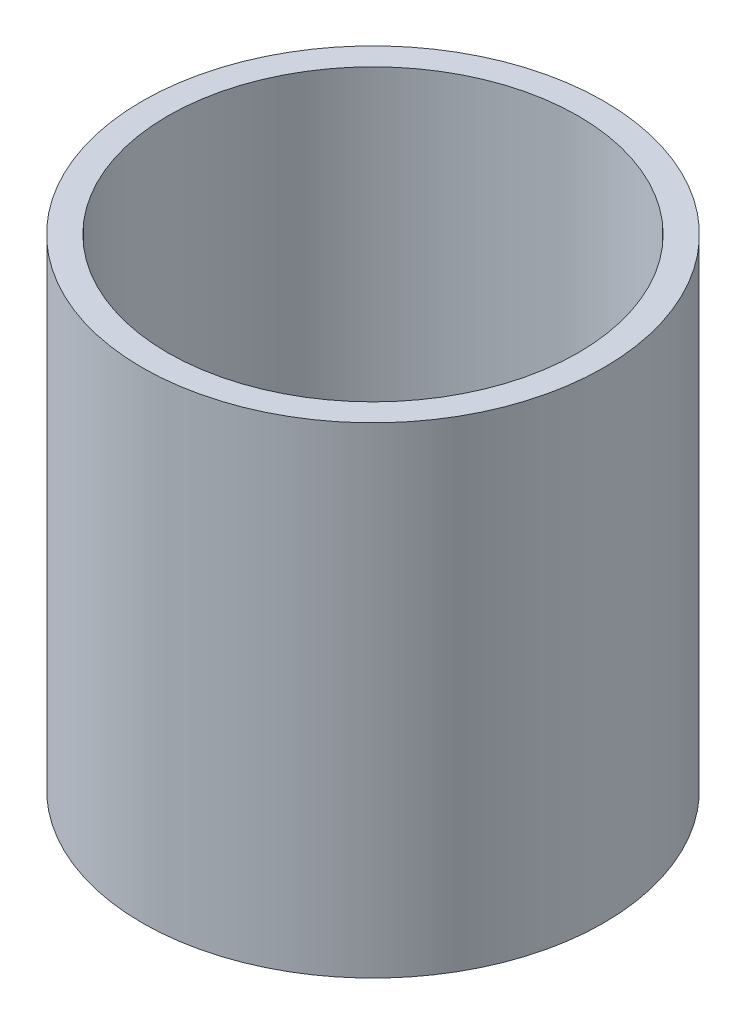
ISO-10303-21;
HEADER;
FILE_DESCRIPTION(('STEP AP214'),'2;1');
FILE_NAME('part.step','',(''),(''),'','','');
FILE_SCHEMA(('AUTOMOTIVE_DESIGN { 1 0 10303 214 1 1 1 1 }'));
ENDSEC;
DATA;
#1=APPLICATION_CONTEXT('core data for automotive mechanical design processes');
#2=APPLICATION_PROTOCOL_DEFINITION('international standard','automotive_design',2000,#1);
#3=PRODUCT_CONTEXT('',#1,'mechanical');
#4=PRODUCT('Part','Part','',(#3));
#5=PRODUCT_RELATED_PRODUCT_CATEGORY('part','',(#4));
#6=PRODUCT_DEFINITION_FORMATION('','',#4);
#7=PRODUCT_DEFINITION_CONTEXT('part definition',#1,'design');
#8=PRODUCT_DEFINITION('design','',#6,#7);
#9=PRODUCT_DEFINITION_SHAPE('','',#8);
#10=(LENGTH_UNIT() NAMED_UNIT(*) SI_UNIT(.MILLI.,.METRE.));
#11=(NAMED_UNIT(*) PLANE_ANGLE_UNIT() SI_UNIT($,.RADIAN.));
#12=(NAMED_UNIT(*) SI_UNIT($,.STERADIAN.) SOLID_ANGLE_UNIT());
#13=UNCERTAINTY_MEASURE_WITH_UNIT(LENGTH_MEASURE(1.E-05),#10,'distance_accuracy_value','');
#14=(GEOMETRIC_REPRESENTATION_CONTEXT(3) GLOBAL_UNCERTAINTY_ASSIGNED_CONTEXT((#13)) GLOBAL_UNIT_ASSIGNED_CONTEXT((#10,
#11,#12)) REPRESENTATION_CONTEXT('',''));
#15=CARTESIAN_POINT('',(0.,0.,0.));
#16=DIRECTION('',(0.,0.,1.));
#17=DIRECTION('',(1.,0.,0.));
#18=AXIS2_PLACEMENT_3D('',#15,#16,#17);
#19=CARTESIAN_POINT('',(0.,9.525,0.));
#20=DIRECTION('',(0.,-1.,0.));
#21=DIRECTION('',(0.,0.,-1.));
#22=AXIS2_PLACEMENT_3D('',#19,#20,#21);
#23=CYLINDRICAL_SURFACE('',#22,4.572);
#24=CARTESIAN_POINT('',(0.,9.525,0.));
#25=DIRECTION('',(0.,1.,0.));
#26=DIRECTION('',(0.,0.,1.));
#27=AXIS2_PLACEMENT_3D('',#24,#25,#26);
#28=CIRCLE('',#27,4.572);
#29=CARTESIAN_POINT('',(0.,9.525,-4.572));
#30=VERTEX_POINT('',#29);
#31=EDGE_CURVE('E10',#30,#30,#28,.T.);
#32=CARTESIAN_POINT('',(0.,0.,0.));
#33=DIRECTION('',(0.,1.,0.));
#34=DIRECTION('',(0.,0.,1.));
#35=AXIS2_PLACEMENT_3D('',#32,#33,#34);
#36=CIRCLE('',#35,4.572);
#37=CARTESIAN_POINT('',(0.,0.,-4.572));
#38=VERTEX_POINT('',#37);
#39=EDGE_CURVE('E34',#38,#38,#36,.T.);
#40=CARTESIAN_POINT('',(0.,9.525,-4.572));
#41=CARTESIAN_POINT('',(0.,9.42578125,-4.572));
#42=CARTESIAN_POINT('',(0.,9.3265625,-4.572));
#43=CARTESIAN_POINT('',(0.,9.128125,-4.572));
#44=CARTESIAN_POINT('',(0.,9.02890625,-4.572));
#45=CARTESIAN_POINT('',(0.,8.83046875,-4.572));
#46=CARTESIAN_POINT('',(0.,8.73125,-4.572));
#47=CARTESIAN_POINT('',(0.,8.5328125,-4.572));
#48=CARTESIAN_POINT('',(0.,8.43359375,-4.572));
#49=CARTESIAN_POINT('',(0.,8.23515625,-4.572));
#50=CARTESIAN_POINT('',(0.,8.1359375,-4.572));
#51=CARTESIAN_POINT('',(0.,7.9375,-4.572));
#52=CARTESIAN_POINT('',(0.,7.83828125,-4.572));
#53=CARTESIAN_POINT('',(0.,7.63984375,-4.572));
#54=CARTESIAN_POINT('',(0.,7.540625,-4.572));
#55=CARTESIAN_POINT('',(0.,7.3421875,-4.572));
#56=CARTESIAN_POINT('',(0.,7.24296875,-4.572));
#57=CARTESIAN_POINT('',(0.,7.04453125,-4.572));
#58=CARTESIAN_POINT('',(0.,6.9453125,-4.572));
#59=CARTESIAN_POINT('',(0.,6.746875,-4.572));
#60=CARTESIAN_POINT('',(0.,6.64765625,-4.572));
#61=CARTESIAN_POINT('',(0.,6.44921875,-4.572));
#62=CARTESIAN_POINT('',(0.,6.35,-4.572));
#63=CARTESIAN_POINT('',(0.,6.1515625,-4.572));
#64=CARTESIAN_POINT('',(0.,6.05234375,-4.572));
#65=CARTESIAN_POINT('',(0.,5.85390625,-4.572));
#66=CARTESIAN_POINT('',(0.,5.7546875,-4.572));
#67=CARTESIAN_POINT('',(0.,5.55625,-4.572));
#68=CARTESIAN_POINT('',(0.,5.45703125,-4.572));
#69=CARTESIAN_POINT('',(0.,5.25859375,-4.572));
#70=CARTESIAN_POINT('',(0.,5.159375,-4.572));
#71=CARTESIAN_POINT('',(0.,4.9609375,-4.572));
#72=CARTESIAN_POINT('',(0.,4.86171875,-4.572));
#73=CARTESIAN_POINT('',(0.,4.66328125,-4.572));
#74=CARTESIAN_POINT('',(0.,4.5640625,-4.572));
#75=CARTESIAN_POINT('',(0.,4.365625,-4.572));
#76=CARTESIAN_POINT('',(0.,4.26640625,-4.572));
#77=CARTESIAN_POINT('',(0.,4.06796875,-4.572));
#78=CARTESIAN_POINT('',(0.,3.96875,-4.572));
#79=CARTESIAN_POINT('',(0.,3.7703125,-4.572));
#80=CARTESIAN_POINT('',(0.,3.67109375,-4.572));
#81=CARTESIAN_POINT('',(0.,3.47265625,-4.572));
#82=CARTESIAN_POINT('',(0.,3.3734375,-4.572));
#83=CARTESIAN_POINT('',(0.,3.175,-4.572));
#84=CARTESIAN_POINT('',(0.,3.07578125,-4.572));
#85=CARTESIAN_POINT('',(0.,2.87734375,-4.572));
#86=CARTESIAN_POINT('',(0.,2.778125,-4.572));
#87=CARTESIAN_POINT('',(0.,2.5796875,-4.572));
#88=CARTESIAN_POINT('',(0.,2.48046875,-4.572));
#89=CARTESIAN_POINT('',(0.,2.28203125,-4.572));
#90=CARTESIAN_POINT('',(0.,2.1828125,-4.572));
#91=CARTESIAN_POINT('',(0.,1.984375,-4.572));
#92=CARTESIAN_POINT('',(0.,1.88515625,-4.572));
#93=CARTESIAN_POINT('',(0.,1.68671875,-4.572));
#94=CARTESIAN_POINT('',(0.,1.5875,-4.572));
#95=CARTESIAN_POINT('',(0.,1.3890625,-4.572));
#96=CARTESIAN_POINT('',(0.,1.28984375,-4.572));
#97=CARTESIAN_POINT('',(0.,1.09140625,-4.572));
#98=CARTESIAN_POINT('',(0.,0.992187500000001,-4.572));
#99=CARTESIAN_POINT('',(0.,0.793750000000001,-4.572));
#100=CARTESIAN_POINT('',(0.,0.69453125,-4.572));
#101=CARTESIAN_POINT('',(0.,0.49609375,-4.572));
#102=CARTESIAN_POINT('',(0.,0.396875,-4.572));
#103=CARTESIAN_POINT('',(0.,0.1984375,-4.572));
#104=CARTESIAN_POINT('',(0.,0.0992187500000001,-4.572));
#105=CARTESIAN_POINT('',(0.,0.,-4.572));
#106=B_SPLINE_CURVE_WITH_KNOTS('',3,(#40,#41,#42,#43,#44,#45,#46,#47,#48,#49,#50,#51,#52,#53,
#54,#55,#56,#57,#58,#59,#60,#61,#62,#63,#64,#65,#66,#67,#68,#69,#70,#71,#72,#73,#74,#75,#76,#77,
#78,#79,#80,#81,#82,#83,#84,#85,#86,#87,#88,#89,#90,#91,#92,#93,#94,#95,#96,#97,#98,#99,#100,
#101,#102,#103,#104,#105),.UNSPECIFIED.,.F.,.F.,(4,2,2,2,2,2,2,2,2,2,2,2,2,2,2,2,2,2,2,2,2,2,2,
2,2,2,2,2,2,2,2,2,4),(0.,0.29765625,0.5953125,0.892968750000001,1.190625,1.48828125,1.7859375,
2.08359375,2.38125,2.67890625,2.9765625,3.27421875,3.571875,3.86953125,4.1671875,4.46484375,
4.7625,5.06015625,5.3578125,5.65546875,5.953125,6.25078125,6.5484375,6.84609375,7.14375,
7.44140625,7.7390625,8.03671875,8.334375,8.63203125,8.9296875,9.22734375,9.525),.UNSPECIFIED.);
#107=EDGE_CURVE('BSEAM31',#30,#38,#106,.T.);
#108=ORIENTED_EDGE('',*,*,#31,.F.);
#109=ORIENTED_EDGE('',*,*,#39,.T.);
#110=ORIENTED_EDGE('',*,*,#107,.T.);
#111=ORIENTED_EDGE('',*,*,#107,.F.);
#112=EDGE_LOOP('',(#108,#110,#109,#111));
#113=FACE_BOUND('',#112,.T.);
#114=ADVANCED_FACE('F31',(#113),#23,.T.);
#115=CARTESIAN_POINT('',(0.,9.525,0.));
#116=DIRECTION('',(0.,1.,0.));
#117=DIRECTION('',(0.,0.,1.));
#118=AXIS2_PLACEMENT_3D('',#115,#116,#117);
#119=PLANE('',#118);
#120=CARTESIAN_POINT('',(0.,9.525,0.));
#121=DIRECTION('',(0.,1.,0.));
#122=DIRECTION('',(0.,0.,1.));
#123=AXIS2_PLACEMENT_3D('',#120,#121,#122);
#124=CIRCLE('',#123,4.064);
#125=CARTESIAN_POINT('',(0.,9.525,4.064));
#126=VERTEX_POINT('',#125);
#127=EDGE_CURVE('E43',#126,#126,#124,.T.);
#128=ORIENTED_EDGE('',*,*,#127,.F.);
#129=EDGE_LOOP('',(#128));
#130=FACE_BOUND('',#129,.T.);
#131=ORIENTED_EDGE('',*,*,#31,.T.);
#132=EDGE_LOOP('',(#131));
#133=FACE_BOUND('',#132,.T.);
#134=ADVANCED_FACE('F58',(#130,#133),#119,.T.);
#135=CARTESIAN_POINT('',(0.,0.,0.));
#136=DIRECTION('',(0.,1.,0.));
#137=DIRECTION('',(0.,0.,1.));
#138=AXIS2_PLACEMENT_3D('',#135,#136,#137);
#139=PLANE('',#138);
#140=CARTESIAN_POINT('',(0.,0.,0.));
#141=DIRECTION('',(0.,1.,0.));
#142=DIRECTION('',(0.,0.,1.));
#143=AXIS2_PLACEMENT_3D('',#140,#141,#142);
#144=CIRCLE('',#143,4.064);
#145=CARTESIAN_POINT('',(0.,0.,4.064));
#146=VERTEX_POINT('',#145);
#147=EDGE_CURVE('E41',#146,#146,#144,.T.);
#148=ORIENTED_EDGE('',*,*,#147,.T.);
#149=EDGE_LOOP('',(#148));
#150=FACE_BOUND('',#149,.T.);
#151=ORIENTED_EDGE('',*,*,#39,.F.);
#152=EDGE_LOOP('',(#151));
#153=FACE_BOUND('',#152,.T.);
#154=ADVANCED_FACE('F49',(#150,#153),#139,.F.);
#155=CARTESIAN_POINT('',(0.,0.,0.));
#156=DIRECTION('',(0.,1.,0.));
#157=DIRECTION('',(0.,0.,1.));
#158=AXIS2_PLACEMENT_3D('',#155,#156,#157);
#159=CYLINDRICAL_SURFACE('',#158,4.064);
#160=CARTESIAN_POINT('',(0.,0.,4.064));
#161=CARTESIAN_POINT('',(0.,0.0992187499999999,4.064));
#162=CARTESIAN_POINT('',(0.,0.1984375,4.064));
#163=CARTESIAN_POINT('',(0.,0.396875,4.064));
#164=CARTESIAN_POINT('',(0.,0.49609375,4.064));
#165=CARTESIAN_POINT('',(0.,0.69453125,4.064));
#166=CARTESIAN_POINT('',(0.,0.79375,4.064));
#167=CARTESIAN_POINT('',(0.,0.9921875,4.064));
#168=CARTESIAN_POINT('',(0.,1.09140625,4.064));
#169=CARTESIAN_POINT('',(0.,1.28984375,4.064));
#170=CARTESIAN_POINT('',(0.,1.3890625,4.064));
#171=CARTESIAN_POINT('',(0.,1.5875,4.064));
#172=CARTESIAN_POINT('',(0.,1.68671875,4.064));
#173=CARTESIAN_POINT('',(0.,1.88515625,4.064));
#174=CARTESIAN_POINT('',(0.,1.984375,4.064));
#175=CARTESIAN_POINT('',(0.,2.1828125,4.064));
#176=CARTESIAN_POINT('',(0.,2.28203125,4.064));
#177=CARTESIAN_POINT('',(0.,2.48046875,4.064));
#178=CARTESIAN_POINT('',(0.,2.5796875,4.064));
#179=CARTESIAN_POINT('',(0.,2.778125,4.064));
#180=CARTESIAN_POINT('',(0.,2.87734375,4.064));
#181=CARTESIAN_POINT('',(0.,3.07578125,4.064));
#182=CARTESIAN_POINT('',(0.,3.175,4.064));
#183=CARTESIAN_POINT('',(0.,3.3734375,4.064));
#184=CARTESIAN_POINT('',(0.,3.47265625,4.064));
#185=CARTESIAN_POINT('',(0.,3.67109375,4.064));
#186=CARTESIAN_POINT('',(0.,3.7703125,4.064));
#187=CARTESIAN_POINT('',(0.,3.96875,4.064));
#188=CARTESIAN_POINT('',(0.,4.06796875,4.064));
#189=CARTESIAN_POINT('',(0.,4.26640625,4.064));
#190=CARTESIAN_POINT('',(0.,4.365625,4.064));
#191=CARTESIAN_POINT('',(0.,4.5640625,4.064));
#192=CARTESIAN_POINT('',(0.,4.66328125,4.064));
#193=CARTESIAN_POINT('',(0.,4.86171875,4.064));
#194=CARTESIAN_POINT('',(0.,4.9609375,4.064));
#195=CARTESIAN_POINT('',(0.,5.159375,4.064));
#196=CARTESIAN_POINT('',(0.,5.25859375,4.064));
#197=CARTESIAN_POINT('',(0.,5.45703125,4.064));
#198=CARTESIAN_POINT('',(0.,5.55625,4.064));
#199=CARTESIAN_POINT('',(0.,5.7546875,4.064));
#200=CARTESIAN_POINT('',(0.,5.85390625,4.064));
#201=CARTESIAN_POINT('',(0.,6.05234375,4.064));
#202=CARTESIAN_POINT('',(0.,6.1515625,4.064));
#203=CARTESIAN_POINT('',(0.,6.35,4.064));
#204=CARTESIAN_POINT('',(0.,6.44921875,4.064));
#205=CARTESIAN_POINT('',(0.,6.64765625,4.064));
#206=CARTESIAN_POINT('',(0.,6.746875,4.064));
#207=CARTESIAN_POINT('',(0.,6.9453125,4.064));
#208=CARTESIAN_POINT('',(0.,7.04453125,4.064));
#209=CARTESIAN_POINT('',(0.,7.24296875,4.064));
#210=CARTESIAN_POINT('',(0.,7.3421875,4.064));
#211=CARTESIAN_POINT('',(0.,7.540625,4.064));
#212=CARTESIAN_POINT('',(0.,7.63984375,4.064));
#213=CARTESIAN_POINT('',(0.,7.83828125,4.064));
#214=CARTESIAN_POINT('',(0.,7.9375,4.064));
#215=CARTESIAN_POINT('',(0.,8.1359375,4.064));
#216=CARTESIAN_POINT('',(0.,8.23515625,4.064));
#217=CARTESIAN_POINT('',(0.,8.43359375,4.064));
#218=CARTESIAN_POINT('',(0.,8.5328125,4.064));
#219=CARTESIAN_POINT('',(0.,8.73125,4.064));
#220=CARTESIAN_POINT('',(0.,8.83046875,4.064));
#221=CARTESIAN_POINT('',(0.,9.02890625,4.064));
#222=CARTESIAN_POINT('',(0.,9.128125,4.064));
#223=CARTESIAN_POINT('',(0.,9.3265625,4.064));
#224=CARTESIAN_POINT('',(0.,9.42578125,4.064));
#225=CARTESIAN_POINT('',(0.,9.525,4.064));
#226=B_SPLINE_CURVE_WITH_KNOTS('',3,(#160,#161,#162,#163,#164,#165,#166,#167,#168,#169,#170,
#171,#172,#173,#174,#175,#176,#177,#178,#179,#180,#181,#182,#183,#184,#185,#186,#187,#188,#189,
#190,#191,#192,#193,#194,#195,#196,#197,#198,#199,#200,#201,#202,#203,#204,#205,#206,#207,#208,
#209,#210,#211,#212,#213,#214,#215,#216,#217,#218,#219,#220,#221,#222,#223,#224,#225),
.UNSPECIFIED.,.F.,.F.,(4,2,2,2,2,2,2,2,2,2,2,2,2,2,2,2,2,2,2,2,2,2,2,2,2,2,2,2,2,2,2,2,4),(0.,
0.29765625,0.5953125,0.89296875,1.190625,1.48828125,1.7859375,2.08359375,2.38125,2.67890625,
2.9765625,3.27421875,3.571875,3.86953125,4.1671875,4.46484375,4.7625,5.06015625,5.3578125,
5.65546875,5.953125,6.25078125,6.5484375,6.84609375,7.14375,7.44140625,7.7390625,8.03671875,
8.334375,8.63203125,8.9296875,9.22734375,9.525),.UNSPECIFIED.);
#227=EDGE_CURVE('BSEAM52',#146,#126,#226,.T.);
#228=ORIENTED_EDGE('',*,*,#147,.F.);
#229=ORIENTED_EDGE('',*,*,#127,.T.);
#230=ORIENTED_EDGE('',*,*,#227,.T.);
#231=ORIENTED_EDGE('',*,*,#227,.F.);
#232=EDGE_LOOP('',(#228,#230,#229,#231));
#233=FACE_BOUND('',#232,.T.);
#234=ADVANCED_FACE('F52',(#233),#159,.F.);
#235=CLOSED_SHELL('',(#114,#134,#154,#234));
#236=MANIFOLD_SOLID_BREP('B2',#235);
#237=ADVANCED_BREP_SHAPE_REPRESENTATION('',(#18,#236),#14);
#238=SHAPE_DEFINITION_REPRESENTATION(#9,#237);
ENDSEC;
END-ISO-10303-21;
